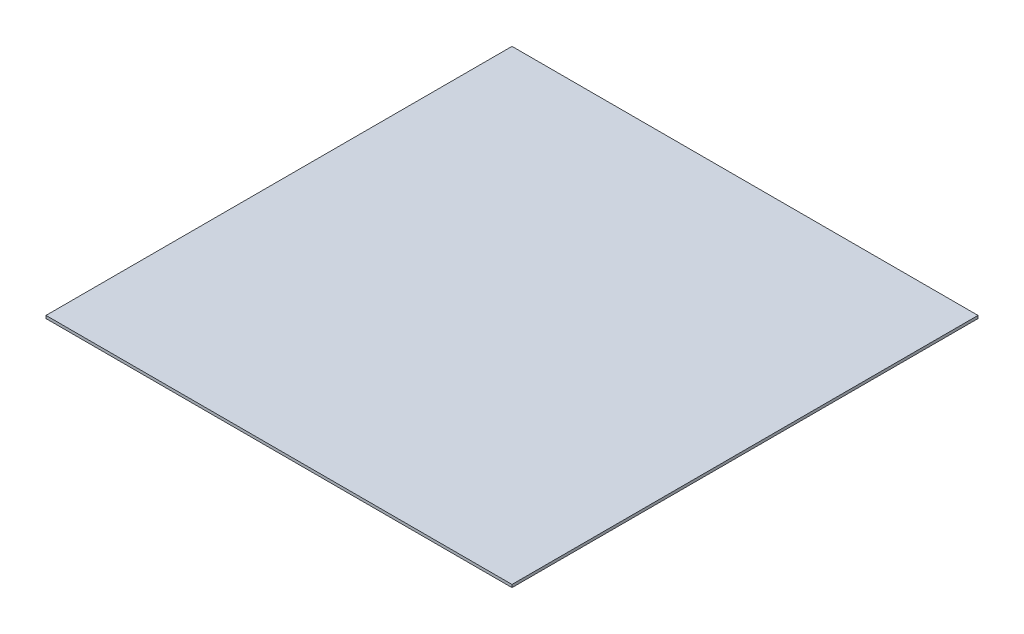
ISO-10303-21;
HEADER;
FILE_DESCRIPTION(('STEP AP214'),'2;1');
FILE_NAME('part.step','',(''),(''),'','','');
FILE_SCHEMA(('AUTOMOTIVE_DESIGN { 1 0 10303 214 1 1 1 1 }'));
ENDSEC;
DATA;
#1=APPLICATION_CONTEXT('core data for automotive mechanical design processes');
#2=APPLICATION_PROTOCOL_DEFINITION('international standard','automotive_design',2000,#1);
#3=PRODUCT_CONTEXT('',#1,'mechanical');
#4=PRODUCT('Part','Part','',(#3));
#5=PRODUCT_RELATED_PRODUCT_CATEGORY('part','',(#4));
#6=PRODUCT_DEFINITION_FORMATION('','',#4);
#7=PRODUCT_DEFINITION_CONTEXT('part definition',#1,'design');
#8=PRODUCT_DEFINITION('design','',#6,#7);
#9=PRODUCT_DEFINITION_SHAPE('','',#8);
#10=(LENGTH_UNIT() NAMED_UNIT(*) SI_UNIT(.MILLI.,.METRE.));
#11=(NAMED_UNIT(*) PLANE_ANGLE_UNIT() SI_UNIT($,.RADIAN.));
#12=(NAMED_UNIT(*) SI_UNIT($,.STERADIAN.) SOLID_ANGLE_UNIT());
#13=UNCERTAINTY_MEASURE_WITH_UNIT(LENGTH_MEASURE(1.E-05),#10,'distance_accuracy_value','');
#14=(GEOMETRIC_REPRESENTATION_CONTEXT(3) GLOBAL_UNCERTAINTY_ASSIGNED_CONTEXT((#13)) GLOBAL_UNIT_ASSIGNED_CONTEXT((#10,
#11,#12)) REPRESENTATION_CONTEXT('',''));
#15=CARTESIAN_POINT('',(0.,0.,0.));
#16=DIRECTION('',(0.,0.,1.));
#17=DIRECTION('',(1.,0.,0.));
#18=AXIS2_PLACEMENT_3D('',#15,#16,#17);
#19=CARTESIAN_POINT('',(250.,1.5,-250.));
#20=DIRECTION('',(-1.,0.,0.));
#21=DIRECTION('',(0.,0.,1.));
#22=AXIS2_PLACEMENT_3D('',#19,#20,#21);
#23=PLANE('',#22);
#24=DIRECTION('',(0.,0.,-1.));
#25=VECTOR('',#24,1.);
#26=CARTESIAN_POINT('',(250.,-1.5,-250.));
#27=LINE('',#26,#25);
#28=CARTESIAN_POINT('',(250.,-1.5,250.));
#29=VERTEX_POINT('',#28);
#30=CARTESIAN_POINT('',(250.,-1.5,-250.));
#31=VERTEX_POINT('',#30);
#32=EDGE_CURVE('E108',#29,#31,#27,.T.);
#33=ORIENTED_EDGE('',*,*,#32,.T.);
#34=DIRECTION('',(0.,-1.,0.));
#35=VECTOR('',#34,1.);
#36=CARTESIAN_POINT('',(250.,1.5,-250.));
#37=LINE('',#36,#35);
#38=CARTESIAN_POINT('',(250.,1.5,-250.));
#39=VERTEX_POINT('',#38);
#40=EDGE_CURVE('E11',#39,#31,#37,.T.);
#41=ORIENTED_EDGE('',*,*,#40,.F.);
#42=DIRECTION('',(0.,0.,-1.));
#43=VECTOR('',#42,1.);
#44=CARTESIAN_POINT('',(250.,1.5,-250.));
#45=LINE('',#44,#43);
#46=CARTESIAN_POINT('',(250.,1.5,250.));
#47=VERTEX_POINT('',#46);
#48=EDGE_CURVE('E96',#47,#39,#45,.T.);
#49=ORIENTED_EDGE('',*,*,#48,.F.);
#50=DIRECTION('',(0.,-1.,0.));
#51=VECTOR('',#50,1.);
#52=CARTESIAN_POINT('',(250.,1.5,250.));
#53=LINE('',#52,#51);
#54=EDGE_CURVE('E104',#47,#29,#53,.T.);
#55=ORIENTED_EDGE('',*,*,#54,.T.);
#56=EDGE_LOOP('',(#33,#41,#49,#55));
#57=FACE_BOUND('',#56,.T.);
#58=ADVANCED_FACE('F45',(#57),#23,.F.);
#59=CARTESIAN_POINT('',(-250.,1.5,-250.));
#60=DIRECTION('',(0.,0.,1.));
#61=DIRECTION('',(1.,0.,0.));
#62=AXIS2_PLACEMENT_3D('',#59,#60,#61);
#63=PLANE('',#62);
#64=DIRECTION('',(-1.,0.,0.));
#65=VECTOR('',#64,1.);
#66=CARTESIAN_POINT('',(-250.,-1.5,-250.));
#67=LINE('',#66,#65);
#68=CARTESIAN_POINT('',(-250.,-1.5,-250.));
#69=VERTEX_POINT('',#68);
#70=EDGE_CURVE('E100',#31,#69,#67,.T.);
#71=ORIENTED_EDGE('',*,*,#70,.T.);
#72=DIRECTION('',(0.,-1.,0.));
#73=VECTOR('',#72,1.);
#74=CARTESIAN_POINT('',(-250.,1.5,-250.));
#75=LINE('',#74,#73);
#76=CARTESIAN_POINT('',(-250.,1.5,-250.));
#77=VERTEX_POINT('',#76);
#78=EDGE_CURVE('E53',#77,#69,#75,.T.);
#79=ORIENTED_EDGE('',*,*,#78,.F.);
#80=DIRECTION('',(-1.,0.,0.));
#81=VECTOR('',#80,1.);
#82=CARTESIAN_POINT('',(-250.,1.5,-250.));
#83=LINE('',#82,#81);
#84=EDGE_CURVE('E91',#39,#77,#83,.T.);
#85=ORIENTED_EDGE('',*,*,#84,.F.);
#86=ORIENTED_EDGE('',*,*,#40,.T.);
#87=EDGE_LOOP('',(#71,#79,#85,#86));
#88=FACE_BOUND('',#87,.T.);
#89=ADVANCED_FACE('F99',(#88),#63,.F.);
#90=CARTESIAN_POINT('',(-250.,1.5,-250.));
#91=DIRECTION('',(1.,0.,0.));
#92=DIRECTION('',(0.,0.,-1.));
#93=AXIS2_PLACEMENT_3D('',#90,#91,#92);
#94=PLANE('',#93);
#95=DIRECTION('',(0.,0.,1.));
#96=VECTOR('',#95,1.);
#97=CARTESIAN_POINT('',(-250.,-1.5,-250.));
#98=LINE('',#97,#96);
#99=CARTESIAN_POINT('',(-250.,-1.5,250.));
#100=VERTEX_POINT('',#99);
#101=EDGE_CURVE('E78',#69,#100,#98,.T.);
#102=ORIENTED_EDGE('',*,*,#101,.T.);
#103=DIRECTION('',(0.,-1.,0.));
#104=VECTOR('',#103,1.);
#105=CARTESIAN_POINT('',(-250.,1.5,250.));
#106=LINE('',#105,#104);
#107=CARTESIAN_POINT('',(-250.,1.5,250.));
#108=VERTEX_POINT('',#107);
#109=EDGE_CURVE('E101',#108,#100,#106,.T.);
#110=ORIENTED_EDGE('',*,*,#109,.F.);
#111=DIRECTION('',(0.,0.,1.));
#112=VECTOR('',#111,1.);
#113=CARTESIAN_POINT('',(-250.,1.5,-250.));
#114=LINE('',#113,#112);
#115=EDGE_CURVE('E94',#77,#108,#114,.T.);
#116=ORIENTED_EDGE('',*,*,#115,.F.);
#117=ORIENTED_EDGE('',*,*,#78,.T.);
#118=EDGE_LOOP('',(#102,#110,#116,#117));
#119=FACE_BOUND('',#118,.T.);
#120=ADVANCED_FACE('F102',(#119),#94,.F.);
#121=CARTESIAN_POINT('',(-250.,1.5,250.));
#122=DIRECTION('',(0.,0.,-1.));
#123=DIRECTION('',(-1.,0.,0.));
#124=AXIS2_PLACEMENT_3D('',#121,#122,#123);
#125=PLANE('',#124);
#126=DIRECTION('',(1.,0.,0.));
#127=VECTOR('',#126,1.);
#128=CARTESIAN_POINT('',(-250.,-1.5,250.));
#129=LINE('',#128,#127);
#130=EDGE_CURVE('E84',#100,#29,#129,.T.);
#131=ORIENTED_EDGE('',*,*,#130,.T.);
#132=ORIENTED_EDGE('',*,*,#54,.F.);
#133=DIRECTION('',(1.,0.,0.));
#134=VECTOR('',#133,1.);
#135=CARTESIAN_POINT('',(-250.,1.5,250.));
#136=LINE('',#135,#134);
#137=EDGE_CURVE('E61',#108,#47,#136,.T.);
#138=ORIENTED_EDGE('',*,*,#137,.F.);
#139=ORIENTED_EDGE('',*,*,#109,.T.);
#140=EDGE_LOOP('',(#131,#132,#138,#139));
#141=FACE_BOUND('',#140,.T.);
#142=ADVANCED_FACE('F115',(#141),#125,.F.);
#143=CARTESIAN_POINT('',(0.,1.5,0.));
#144=DIRECTION('',(0.,1.,0.));
#145=DIRECTION('',(0.,0.,1.));
#146=AXIS2_PLACEMENT_3D('',#143,#144,#145);
#147=PLANE('',#146);
#148=ORIENTED_EDGE('',*,*,#48,.T.);
#149=ORIENTED_EDGE('',*,*,#84,.T.);
#150=ORIENTED_EDGE('',*,*,#115,.T.);
#151=ORIENTED_EDGE('',*,*,#137,.T.);
#152=EDGE_LOOP('',(#148,#149,#150,#151));
#153=FACE_BOUND('',#152,.T.);
#154=ADVANCED_FACE('F92',(#153),#147,.T.);
#155=CARTESIAN_POINT('',(0.,-1.5,0.));
#156=DIRECTION('',(0.,1.,0.));
#157=DIRECTION('',(0.,0.,1.));
#158=AXIS2_PLACEMENT_3D('',#155,#156,#157);
#159=PLANE('',#158);
#160=ORIENTED_EDGE('',*,*,#32,.F.);
#161=ORIENTED_EDGE('',*,*,#130,.F.);
#162=ORIENTED_EDGE('',*,*,#101,.F.);
#163=ORIENTED_EDGE('',*,*,#70,.F.);
#164=EDGE_LOOP('',(#160,#161,#162,#163));
#165=FACE_BOUND('',#164,.T.);
#166=ADVANCED_FACE('F118',(#165),#159,.F.);
#167=CLOSED_SHELL('',(#58,#89,#120,#142,#154,#166));
#168=MANIFOLD_SOLID_BREP('B2',#167);
#169=ADVANCED_BREP_SHAPE_REPRESENTATION('',(#18,#168),#14);
#170=SHAPE_DEFINITION_REPRESENTATION(#9,#169);
ENDSEC;
END-ISO-10303-21;
